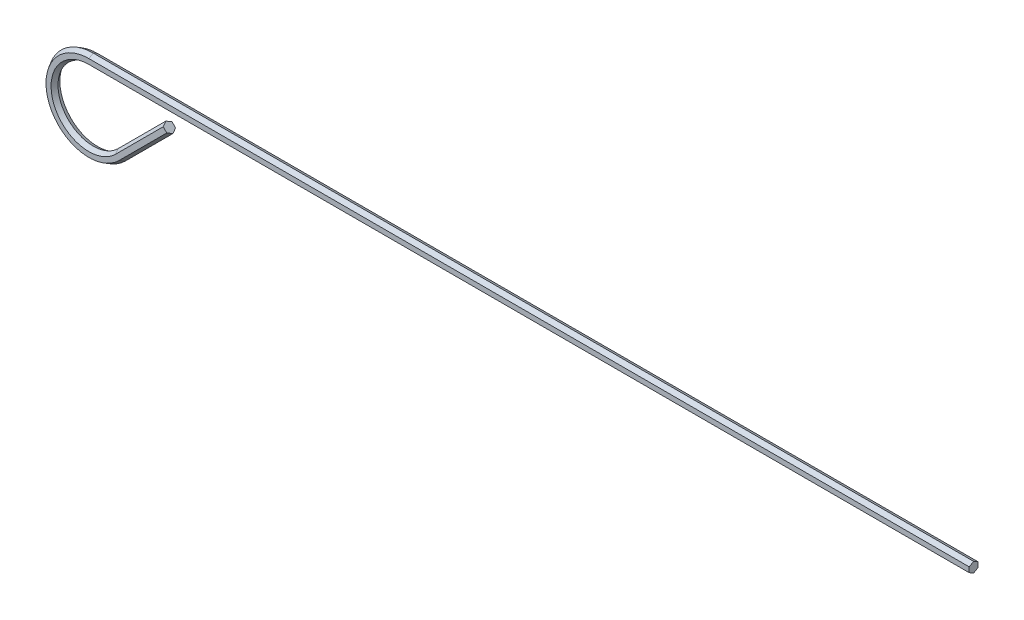
ISO-10303-21;
HEADER;
FILE_DESCRIPTION(('STEP AP214'),'2;1');
FILE_NAME('part.step','',(''),(''),'','','');
FILE_SCHEMA(('AUTOMOTIVE_DESIGN { 1 0 10303 214 1 1 1 1 }'));
ENDSEC;
DATA;
#1=APPLICATION_CONTEXT('core data for automotive mechanical design processes');
#2=APPLICATION_PROTOCOL_DEFINITION('international standard','automotive_design',2000,#1);
#3=PRODUCT_CONTEXT('',#1,'mechanical');
#4=PRODUCT('Part','Part','',(#3));
#5=PRODUCT_RELATED_PRODUCT_CATEGORY('part','',(#4));
#6=PRODUCT_DEFINITION_FORMATION('','',#4);
#7=PRODUCT_DEFINITION_CONTEXT('part definition',#1,'design');
#8=PRODUCT_DEFINITION('design','',#6,#7);
#9=PRODUCT_DEFINITION_SHAPE('','',#8);
#10=(LENGTH_UNIT() NAMED_UNIT(*) SI_UNIT(.MILLI.,.METRE.));
#11=(NAMED_UNIT(*) PLANE_ANGLE_UNIT() SI_UNIT($,.RADIAN.));
#12=(NAMED_UNIT(*) SI_UNIT($,.STERADIAN.) SOLID_ANGLE_UNIT());
#13=UNCERTAINTY_MEASURE_WITH_UNIT(LENGTH_MEASURE(1.E-05),#10,'distance_accuracy_value','');
#14=(GEOMETRIC_REPRESENTATION_CONTEXT(3) GLOBAL_UNCERTAINTY_ASSIGNED_CONTEXT((#13)) GLOBAL_UNIT_ASSIGNED_CONTEXT((#10,
#11,#12)) REPRESENTATION_CONTEXT('',''));
#15=CARTESIAN_POINT('',(0.,0.,0.));
#16=DIRECTION('',(0.,0.,1.));
#17=DIRECTION('',(1.,0.,0.));
#18=AXIS2_PLACEMENT_3D('',#15,#16,#17);
#19=CARTESIAN_POINT('',(3.44079956044201,-3.44079956044196,-0.5));
#20=DIRECTION('',(-0.612372435695791,0.612372435695797,0.5));
#21=DIRECTION('',(-0.707106781186551,-0.707106781186544,0.));
#22=AXIS2_PLACEMENT_3D('',#19,#20,#21);
#23=PLANE('',#22);
#24=DIRECTION('',(0.353553390593277,-0.353553390593271,0.866025403784438));
#25=VECTOR('',#24,1.);
#26=CARTESIAN_POINT('',(3.44079956044201,-3.44079956044196,-0.5));
#27=LINE('',#26,#25);
#28=CARTESIAN_POINT('',(3.44079956044201,-3.44079956044196,-0.5));
#29=VERTEX_POINT('',#28);
#30=CARTESIAN_POINT('',(3.64492370567395,-3.64492370567389,0.));
#31=VERTEX_POINT('',#30);
#32=EDGE_CURVE('E133',#29,#31,#27,.T.);
#33=ORIENTED_EDGE('',*,*,#32,.F.);
#34=DIRECTION('',(0.707106781186551,0.707106781186544,0.));
#35=VECTOR('',#34,1.);
#36=CARTESIAN_POINT('',(3.44079956044201,-3.44079956044196,-0.5));
#37=LINE('',#36,#35);
#38=CARTESIAN_POINT('',(8.85501312281519,1.97341400193116,-0.5));
#39=VERTEX_POINT('',#38);
#40=EDGE_CURVE('E42',#29,#39,#37,.T.);
#41=ORIENTED_EDGE('',*,*,#40,.T.);
#42=DIRECTION('',(0.353553390593277,-0.353553390593271,0.866025403784438));
#43=VECTOR('',#42,1.);
#44=CARTESIAN_POINT('',(8.85501312281519,1.97341400193116,-0.5));
#45=LINE('',#44,#43);
#46=CARTESIAN_POINT('',(9.05913726804712,1.76928985669923,0.));
#47=VERTEX_POINT('',#46);
#48=EDGE_CURVE('E49',#39,#47,#45,.T.);
#49=ORIENTED_EDGE('',*,*,#48,.T.);
#50=DIRECTION('',(0.707106781186551,0.707106781186544,0.));
#51=VECTOR('',#50,1.);
#52=CARTESIAN_POINT('',(3.64492370567395,-3.64492370567389,0.));
#53=LINE('',#52,#51);
#54=EDGE_CURVE('E11',#31,#47,#53,.T.);
#55=ORIENTED_EDGE('',*,*,#54,.F.);
#56=EDGE_LOOP('',(#33,#41,#49,#55));
#57=FACE_BOUND('',#56,.T.);
#58=ADVANCED_FACE('F34',(#57),#23,.F.);
#59=CARTESIAN_POINT('',(2.82842712474621,-2.82842712474617,0.));
#60=DIRECTION('',(0.612372435695791,-0.612372435695797,0.5));
#61=DIRECTION('',(0.707106781186551,0.707106781186544,0.));
#62=AXIS2_PLACEMENT_3D('',#59,#60,#61);
#63=PLANE('',#62);
#64=DIRECTION('',(0.353553390593277,-0.353553390593271,-0.866025403784438));
#65=VECTOR('',#64,1.);
#66=CARTESIAN_POINT('',(2.82842712474621,-2.82842712474617,0.));
#67=LINE('',#66,#65);
#68=CARTESIAN_POINT('',(2.82842712474621,-2.82842712474617,0.));
#69=VERTEX_POINT('',#68);
#70=CARTESIAN_POINT('',(3.03255126997815,-3.0325512699781,-0.5));
#71=VERTEX_POINT('',#70);
#72=EDGE_CURVE('E212',#69,#71,#67,.T.);
#73=ORIENTED_EDGE('',*,*,#72,.F.);
#74=DIRECTION('',(0.707106781186551,0.707106781186544,0.));
#75=VECTOR('',#74,1.);
#76=CARTESIAN_POINT('',(2.82842712474621,-2.82842712474617,0.));
#77=LINE('',#76,#75);
#78=CARTESIAN_POINT('',(8.24264068711939,2.58578643762695,0.));
#79=VERTEX_POINT('',#78);
#80=EDGE_CURVE('E256',#69,#79,#77,.T.);
#81=ORIENTED_EDGE('',*,*,#80,.T.);
#82=DIRECTION('',(0.353553390593277,-0.353553390593271,-0.866025403784438));
#83=VECTOR('',#82,1.);
#84=CARTESIAN_POINT('',(8.24264068711939,2.58578643762695,0.));
#85=LINE('',#84,#83);
#86=CARTESIAN_POINT('',(8.44676483235132,2.38166229239502,-0.5));
#87=VERTEX_POINT('',#86);
#88=EDGE_CURVE('E243',#79,#87,#85,.T.);
#89=ORIENTED_EDGE('',*,*,#88,.T.);
#90=DIRECTION('',(0.707106781186551,0.707106781186544,0.));
#91=VECTOR('',#90,1.);
#92=CARTESIAN_POINT('',(3.03255126997815,-3.0325512699781,-0.5));
#93=LINE('',#92,#91);
#94=EDGE_CURVE('E260',#71,#87,#93,.T.);
#95=ORIENTED_EDGE('',*,*,#94,.F.);
#96=EDGE_LOOP('',(#73,#81,#89,#95));
#97=FACE_BOUND('',#96,.T.);
#98=ADVANCED_FACE('F282',(#97),#63,.F.);
#99=CARTESIAN_POINT('',(2.82842712474621,-2.82842712474617,0.));
#100=DIRECTION('',(-0.612372435695791,0.612372435695797,0.5));
#101=DIRECTION('',(-0.707106781186551,-0.707106781186544,0.));
#102=AXIS2_PLACEMENT_3D('',#99,#100,#101);
#103=PLANE('',#102);
#104=DIRECTION('',(0.353553390593277,-0.353553390593271,0.866025403784438));
#105=VECTOR('',#104,1.);
#106=CARTESIAN_POINT('',(2.82842712474621,-2.82842712474617,0.));
#107=LINE('',#106,#105);
#108=CARTESIAN_POINT('',(3.03255126997815,-3.0325512699781,0.5));
#109=VERTEX_POINT('',#108);
#110=EDGE_CURVE('E209',#69,#109,#107,.T.);
#111=ORIENTED_EDGE('',*,*,#110,.T.);
#112=DIRECTION('',(0.707106781186551,0.707106781186544,0.));
#113=VECTOR('',#112,1.);
#114=CARTESIAN_POINT('',(3.03255126997815,-3.0325512699781,0.5));
#115=LINE('',#114,#113);
#116=CARTESIAN_POINT('',(8.44676483235132,2.38166229239502,0.5));
#117=VERTEX_POINT('',#116);
#118=EDGE_CURVE('E252',#109,#117,#115,.T.);
#119=ORIENTED_EDGE('',*,*,#118,.T.);
#120=DIRECTION('',(0.353553390593277,-0.353553390593271,0.866025403784438));
#121=VECTOR('',#120,1.);
#122=CARTESIAN_POINT('',(8.24264068711939,2.58578643762695,0.));
#123=LINE('',#122,#121);
#124=EDGE_CURVE('E240',#79,#117,#123,.T.);
#125=ORIENTED_EDGE('',*,*,#124,.F.);
#126=ORIENTED_EDGE('',*,*,#80,.F.);
#127=EDGE_LOOP('',(#111,#119,#125,#126));
#128=FACE_BOUND('',#127,.T.);
#129=ADVANCED_FACE('F286',(#128),#103,.T.);
#130=CARTESIAN_POINT('',(3.44079956044201,-3.44079956044196,0.5));
#131=DIRECTION('',(0.612372435695791,-0.612372435695797,0.5));
#132=DIRECTION('',(0.707106781186551,0.707106781186544,0.));
#133=AXIS2_PLACEMENT_3D('',#130,#131,#132);
#134=PLANE('',#133);
#135=DIRECTION('',(0.353553390593277,-0.353553390593271,-0.866025403784438));
#136=VECTOR('',#135,1.);
#137=CARTESIAN_POINT('',(3.44079956044201,-3.44079956044196,0.5));
#138=LINE('',#137,#136);
#139=CARTESIAN_POINT('',(3.44079956044201,-3.44079956044196,0.5));
#140=VERTEX_POINT('',#139);
#141=EDGE_CURVE('E160',#140,#31,#138,.T.);
#142=ORIENTED_EDGE('',*,*,#141,.T.);
#143=ORIENTED_EDGE('',*,*,#54,.T.);
#144=DIRECTION('',(0.353553390593277,-0.353553390593271,-0.866025403784438));
#145=VECTOR('',#144,1.);
#146=CARTESIAN_POINT('',(8.85501312281519,1.97341400193116,0.5));
#147=LINE('',#146,#145);
#148=CARTESIAN_POINT('',(8.85501312281519,1.97341400193116,0.5));
#149=VERTEX_POINT('',#148);
#150=EDGE_CURVE('E137',#149,#47,#147,.T.);
#151=ORIENTED_EDGE('',*,*,#150,.F.);
#152=DIRECTION('',(0.707106781186551,0.707106781186544,0.));
#153=VECTOR('',#152,1.);
#154=CARTESIAN_POINT('',(3.44079956044201,-3.44079956044196,0.5));
#155=LINE('',#154,#153);
#156=EDGE_CURVE('E249',#140,#149,#155,.T.);
#157=ORIENTED_EDGE('',*,*,#156,.F.);
#158=EDGE_LOOP('',(#142,#143,#151,#157));
#159=FACE_BOUND('',#158,.T.);
#160=ADVANCED_FACE('F291',(#159),#134,.T.);
#161=CARTESIAN_POINT('',(0.,0.,-0.5));
#162=DIRECTION('',(0.,0.,1.));
#163=DIRECTION('',(1.,0.,0.));
#164=AXIS2_PLACEMENT_3D('',#161,#162,#163);
#165=CONICAL_SURFACE('',#164,4.86602540378444,0.523598775598299);
#166=DIRECTION('',(0.,0.5,0.866025403784438));
#167=VECTOR('',#166,1.);
#168=CARTESIAN_POINT('',(0.,4.86602540378444,-0.5));
#169=LINE('',#168,#167);
#170=CARTESIAN_POINT('',(0.,4.86602540378444,-0.5));
#171=VERTEX_POINT('',#170);
#172=CARTESIAN_POINT('',(0.,5.15470053837925,0.));
#173=VERTEX_POINT('',#172);
#174=EDGE_CURVE('E130',#171,#173,#169,.T.);
#175=ORIENTED_EDGE('',*,*,#174,.F.);
#176=CARTESIAN_POINT('',(0.,0.,-0.5));
#177=DIRECTION('',(0.,0.,1.));
#178=DIRECTION('',(1.,0.,0.));
#179=AXIS2_PLACEMENT_3D('',#176,#177,#178);
#180=CIRCLE('',#179,4.86602540378444);
#181=EDGE_CURVE('E138',#171,#29,#180,.T.);
#182=ORIENTED_EDGE('',*,*,#181,.T.);
#183=ORIENTED_EDGE('',*,*,#32,.T.);
#184=CARTESIAN_POINT('',(0.,0.,0.));
#185=DIRECTION('',(0.,0.,1.));
#186=DIRECTION('',(1.,0.,0.));
#187=AXIS2_PLACEMENT_3D('',#184,#185,#186);
#188=CIRCLE('',#187,5.15470053837925);
#189=EDGE_CURVE('E125',#173,#31,#188,.T.);
#190=ORIENTED_EDGE('',*,*,#189,.F.);
#191=EDGE_LOOP('',(#175,#182,#183,#190));
#192=FACE_BOUND('',#191,.T.);
#193=ADVANCED_FACE('F127',(#192),#165,.T.);
#194=CARTESIAN_POINT('',(0.,0.,0.));
#195=DIRECTION('',(0.,0.,-1.));
#196=DIRECTION('',(-1.,0.,0.));
#197=AXIS2_PLACEMENT_3D('',#194,#195,#196);
#198=CONICAL_SURFACE('',#197,4.,0.523598775598299);
#199=DIRECTION('',(0.,0.5,-0.866025403784438));
#200=VECTOR('',#199,1.);
#201=CARTESIAN_POINT('',(0.,4.,0.));
#202=LINE('',#201,#200);
#203=CARTESIAN_POINT('',(0.,4.,0.));
#204=VERTEX_POINT('',#203);
#205=CARTESIAN_POINT('',(0.,4.28867513459481,-0.5));
#206=VERTEX_POINT('',#205);
#207=EDGE_CURVE('E165',#204,#206,#202,.T.);
#208=ORIENTED_EDGE('',*,*,#207,.F.);
#209=CARTESIAN_POINT('',(0.,0.,0.));
#210=DIRECTION('',(0.,0.,1.));
#211=DIRECTION('',(1.,0.,0.));
#212=AXIS2_PLACEMENT_3D('',#209,#210,#211);
#213=CIRCLE('',#212,4.);
#214=EDGE_CURVE('E224',#204,#69,#213,.T.);
#215=ORIENTED_EDGE('',*,*,#214,.T.);
#216=ORIENTED_EDGE('',*,*,#72,.T.);
#217=CARTESIAN_POINT('',(0.,0.,-0.5));
#218=DIRECTION('',(0.,0.,1.));
#219=DIRECTION('',(1.,0.,0.));
#220=AXIS2_PLACEMENT_3D('',#217,#218,#219);
#221=CIRCLE('',#220,4.28867513459481);
#222=EDGE_CURVE('E228',#206,#71,#221,.T.);
#223=ORIENTED_EDGE('',*,*,#222,.F.);
#224=EDGE_LOOP('',(#208,#215,#216,#223));
#225=FACE_BOUND('',#224,.T.);
#226=ADVANCED_FACE('F278',(#225),#198,.F.);
#227=CARTESIAN_POINT('',(0.,0.,0.));
#228=DIRECTION('',(0.,0.,1.));
#229=DIRECTION('',(1.,0.,0.));
#230=AXIS2_PLACEMENT_3D('',#227,#228,#229);
#231=CONICAL_SURFACE('',#230,4.,0.523598775598299);
#232=DIRECTION('',(0.,0.5,0.866025403784438));
#233=VECTOR('',#232,1.);
#234=CARTESIAN_POINT('',(0.,4.,0.));
#235=LINE('',#234,#233);
#236=CARTESIAN_POINT('',(0.,4.28867513459481,0.5));
#237=VERTEX_POINT('',#236);
#238=EDGE_CURVE('E172',#204,#237,#235,.T.);
#239=ORIENTED_EDGE('',*,*,#238,.T.);
#240=CARTESIAN_POINT('',(0.,0.,0.5));
#241=DIRECTION('',(0.,0.,1.));
#242=DIRECTION('',(1.,0.,0.));
#243=AXIS2_PLACEMENT_3D('',#240,#241,#242);
#244=CIRCLE('',#243,4.28867513459481);
#245=EDGE_CURVE('E220',#237,#109,#244,.T.);
#246=ORIENTED_EDGE('',*,*,#245,.T.);
#247=ORIENTED_EDGE('',*,*,#110,.F.);
#248=ORIENTED_EDGE('',*,*,#214,.F.);
#249=EDGE_LOOP('',(#239,#246,#247,#248));
#250=FACE_BOUND('',#249,.T.);
#251=ADVANCED_FACE('F284',(#250),#231,.F.);
#252=CARTESIAN_POINT('',(0.,0.,0.5));
#253=DIRECTION('',(0.,0.,-1.));
#254=DIRECTION('',(-1.,0.,0.));
#255=AXIS2_PLACEMENT_3D('',#252,#253,#254);
#256=CONICAL_SURFACE('',#255,4.86602540378444,0.523598775598299);
#257=DIRECTION('',(0.,0.5,-0.866025403784438));
#258=VECTOR('',#257,1.);
#259=CARTESIAN_POINT('',(0.,4.86602540378444,0.5));
#260=LINE('',#259,#258);
#261=CARTESIAN_POINT('',(0.,4.86602540378444,0.5));
#262=VERTEX_POINT('',#261);
#263=EDGE_CURVE('E141',#262,#173,#260,.T.);
#264=ORIENTED_EDGE('',*,*,#263,.T.);
#265=ORIENTED_EDGE('',*,*,#189,.T.);
#266=ORIENTED_EDGE('',*,*,#141,.F.);
#267=CARTESIAN_POINT('',(0.,0.,0.5));
#268=DIRECTION('',(0.,0.,1.));
#269=DIRECTION('',(1.,0.,0.));
#270=AXIS2_PLACEMENT_3D('',#267,#268,#269);
#271=CIRCLE('',#270,4.86602540378444);
#272=EDGE_CURVE('E145',#262,#140,#271,.T.);
#273=ORIENTED_EDGE('',*,*,#272,.F.);
#274=EDGE_LOOP('',(#264,#265,#266,#273));
#275=FACE_BOUND('',#274,.T.);
#276=ADVANCED_FACE('F143',(#275),#256,.T.);
#277=CARTESIAN_POINT('',(0.,4.86602540378444,0.5));
#278=DIRECTION('',(0.,-0.866025403784438,-0.5));
#279=DIRECTION('',(0.,0.5,-0.866025403784438));
#280=AXIS2_PLACEMENT_3D('',#277,#278,#279);
#281=PLANE('',#280);
#282=DIRECTION('',(0.,0.5,-0.866025403784438));
#283=VECTOR('',#282,1.);
#284=CARTESIAN_POINT('',(100.,4.86602540378443,0.5));
#285=LINE('',#284,#283);
#286=CARTESIAN_POINT('',(100.,4.86602540378443,0.5));
#287=VERTEX_POINT('',#286);
#288=CARTESIAN_POINT('',(100.,5.15470053837924,0.));
#289=VERTEX_POINT('',#288);
#290=EDGE_CURVE('E155',#287,#289,#285,.T.);
#291=ORIENTED_EDGE('',*,*,#290,.T.);
#292=DIRECTION('',(1.,0.,0.));
#293=VECTOR('',#292,1.);
#294=CARTESIAN_POINT('',(0.,5.15470053837925,0.));
#295=LINE('',#294,#293);
#296=EDGE_CURVE('E152',#173,#289,#295,.T.);
#297=ORIENTED_EDGE('',*,*,#296,.F.);
#298=ORIENTED_EDGE('',*,*,#263,.F.);
#299=DIRECTION('',(1.,0.,0.));
#300=VECTOR('',#299,1.);
#301=CARTESIAN_POINT('',(0.,4.86602540378444,0.5));
#302=LINE('',#301,#300);
#303=EDGE_CURVE('E178',#262,#287,#302,.T.);
#304=ORIENTED_EDGE('',*,*,#303,.T.);
#305=EDGE_LOOP('',(#291,#297,#298,#304));
#306=FACE_BOUND('',#305,.T.);
#307=ADVANCED_FACE('F153',(#306),#281,.F.);
#308=CARTESIAN_POINT('',(0.,4.86602540378444,-0.5));
#309=DIRECTION('',(0.,0.866025403784438,-0.5));
#310=DIRECTION('',(0.,0.5,0.866025403784438));
#311=AXIS2_PLACEMENT_3D('',#308,#309,#310);
#312=PLANE('',#311);
#313=DIRECTION('',(0.,0.5,0.866025403784438));
#314=VECTOR('',#313,1.);
#315=CARTESIAN_POINT('',(100.,4.86602540378443,-0.5));
#316=LINE('',#315,#314);
#317=CARTESIAN_POINT('',(100.,4.86602540378443,-0.5));
#318=VERTEX_POINT('',#317);
#319=EDGE_CURVE('E180',#318,#289,#316,.T.);
#320=ORIENTED_EDGE('',*,*,#319,.F.);
#321=DIRECTION('',(1.,0.,0.));
#322=VECTOR('',#321,1.);
#323=CARTESIAN_POINT('',(0.,4.86602540378444,-0.5));
#324=LINE('',#323,#322);
#325=EDGE_CURVE('E161',#171,#318,#324,.T.);
#326=ORIENTED_EDGE('',*,*,#325,.F.);
#327=ORIENTED_EDGE('',*,*,#174,.T.);
#328=ORIENTED_EDGE('',*,*,#296,.T.);
#329=EDGE_LOOP('',(#320,#326,#327,#328));
#330=FACE_BOUND('',#329,.T.);
#331=ADVANCED_FACE('F163',(#330),#312,.T.);
#332=CARTESIAN_POINT('',(0.,4.28867513459481,-0.5));
#333=DIRECTION('',(0.,0.,-1.));
#334=DIRECTION('',(-1.,0.,0.));
#335=AXIS2_PLACEMENT_3D('',#332,#333,#334);
#336=PLANE('',#335);
#337=DIRECTION('',(0.,1.,0.));
#338=VECTOR('',#337,1.);
#339=CARTESIAN_POINT('',(100.,4.2886751345948,-0.5));
#340=LINE('',#339,#338);
#341=CARTESIAN_POINT('',(100.,4.2886751345948,-0.5));
#342=VERTEX_POINT('',#341);
#343=EDGE_CURVE('E183',#342,#318,#340,.T.);
#344=ORIENTED_EDGE('',*,*,#343,.F.);
#345=DIRECTION('',(1.,0.,0.));
#346=VECTOR('',#345,1.);
#347=CARTESIAN_POINT('',(0.,4.28867513459481,-0.5));
#348=LINE('',#347,#346);
#349=EDGE_CURVE('E201',#206,#342,#348,.T.);
#350=ORIENTED_EDGE('',*,*,#349,.F.);
#351=ORIENTED_EDGE('',*,*,#222,.T.);
#352=ORIENTED_EDGE('',*,*,#94,.T.);
#353=DIRECTION('',(0.707106781186553,-0.707106781186542,0.));
#354=VECTOR('',#353,1.);
#355=CARTESIAN_POINT('',(8.44676483235132,2.38166229239502,-0.5));
#356=LINE('',#355,#354);
#357=EDGE_CURVE('E57',#87,#39,#356,.T.);
#358=ORIENTED_EDGE('',*,*,#357,.T.);
#359=ORIENTED_EDGE('',*,*,#40,.F.);
#360=ORIENTED_EDGE('',*,*,#181,.F.);
#361=ORIENTED_EDGE('',*,*,#325,.T.);
#362=EDGE_LOOP('',(#344,#350,#351,#352,#358,#359,#360,#361));
#363=FACE_BOUND('',#362,.T.);
#364=ADVANCED_FACE('F265',(#363),#336,.T.);
#365=CARTESIAN_POINT('',(0.,4.,0.));
#366=DIRECTION('',(0.,-0.866025403784438,-0.5));
#367=DIRECTION('',(0.,0.5,-0.866025403784438));
#368=AXIS2_PLACEMENT_3D('',#365,#366,#367);
#369=PLANE('',#368);
#370=DIRECTION('',(0.,0.5,-0.866025403784438));
#371=VECTOR('',#370,1.);
#372=CARTESIAN_POINT('',(100.,3.99999999999999,0.));
#373=LINE('',#372,#371);
#374=CARTESIAN_POINT('',(100.,3.99999999999999,0.));
#375=VERTEX_POINT('',#374);
#376=EDGE_CURVE('E186',#375,#342,#373,.T.);
#377=ORIENTED_EDGE('',*,*,#376,.F.);
#378=DIRECTION('',(1.,0.,0.));
#379=VECTOR('',#378,1.);
#380=CARTESIAN_POINT('',(0.,4.,0.));
#381=LINE('',#380,#379);
#382=EDGE_CURVE('E199',#204,#375,#381,.T.);
#383=ORIENTED_EDGE('',*,*,#382,.F.);
#384=ORIENTED_EDGE('',*,*,#207,.T.);
#385=ORIENTED_EDGE('',*,*,#349,.T.);
#386=EDGE_LOOP('',(#377,#383,#384,#385));
#387=FACE_BOUND('',#386,.T.);
#388=ADVANCED_FACE('F274',(#387),#369,.T.);
#389=CARTESIAN_POINT('',(0.,4.,0.));
#390=DIRECTION('',(0.,0.866025403784438,-0.5));
#391=DIRECTION('',(0.,0.5,0.866025403784438));
#392=AXIS2_PLACEMENT_3D('',#389,#390,#391);
#393=PLANE('',#392);
#394=DIRECTION('',(0.,0.5,0.866025403784438));
#395=VECTOR('',#394,1.);
#396=CARTESIAN_POINT('',(100.,3.99999999999999,0.));
#397=LINE('',#396,#395);
#398=CARTESIAN_POINT('',(100.,4.2886751345948,0.5));
#399=VERTEX_POINT('',#398);
#400=EDGE_CURVE('E189',#375,#399,#397,.T.);
#401=ORIENTED_EDGE('',*,*,#400,.T.);
#402=DIRECTION('',(1.,0.,0.));
#403=VECTOR('',#402,1.);
#404=CARTESIAN_POINT('',(0.,4.28867513459481,0.5));
#405=LINE('',#404,#403);
#406=EDGE_CURVE('E195',#237,#399,#405,.T.);
#407=ORIENTED_EDGE('',*,*,#406,.F.);
#408=ORIENTED_EDGE('',*,*,#238,.F.);
#409=ORIENTED_EDGE('',*,*,#382,.T.);
#410=EDGE_LOOP('',(#401,#407,#408,#409));
#411=FACE_BOUND('',#410,.T.);
#412=ADVANCED_FACE('F296',(#411),#393,.F.);
#413=CARTESIAN_POINT('',(0.,4.28867513459481,0.5));
#414=DIRECTION('',(0.,0.,-1.));
#415=DIRECTION('',(-1.,0.,0.));
#416=AXIS2_PLACEMENT_3D('',#413,#414,#415);
#417=PLANE('',#416);
#418=DIRECTION('',(0.,1.,0.));
#419=VECTOR('',#418,1.);
#420=CARTESIAN_POINT('',(100.,4.2886751345948,0.5));
#421=LINE('',#420,#419);
#422=EDGE_CURVE('E149',#399,#287,#421,.T.);
#423=ORIENTED_EDGE('',*,*,#422,.T.);
#424=ORIENTED_EDGE('',*,*,#303,.F.);
#425=ORIENTED_EDGE('',*,*,#272,.T.);
#426=ORIENTED_EDGE('',*,*,#156,.T.);
#427=DIRECTION('',(0.707106781186553,-0.707106781186542,0.));
#428=VECTOR('',#427,1.);
#429=CARTESIAN_POINT('',(8.44676483235132,2.38166229239502,0.5));
#430=LINE('',#429,#428);
#431=EDGE_CURVE('E236',#117,#149,#430,.T.);
#432=ORIENTED_EDGE('',*,*,#431,.F.);
#433=ORIENTED_EDGE('',*,*,#118,.F.);
#434=ORIENTED_EDGE('',*,*,#245,.F.);
#435=ORIENTED_EDGE('',*,*,#406,.T.);
#436=EDGE_LOOP('',(#423,#424,#425,#426,#432,#433,#434,#435));
#437=FACE_BOUND('',#436,.T.);
#438=ADVANCED_FACE('F293',(#437),#417,.F.);
#439=CARTESIAN_POINT('',(9.05913726804712,1.76928985669923,0.));
#440=DIRECTION('',(-0.707106781186542,-0.707106781186553,0.));
#441=DIRECTION('',(0.,0.,-1.));
#442=AXIS2_PLACEMENT_3D('',#439,#440,#441);
#443=PLANE('',#442);
#444=ORIENTED_EDGE('',*,*,#150,.T.);
#445=ORIENTED_EDGE('',*,*,#48,.F.);
#446=ORIENTED_EDGE('',*,*,#357,.F.);
#447=ORIENTED_EDGE('',*,*,#88,.F.);
#448=ORIENTED_EDGE('',*,*,#124,.T.);
#449=ORIENTED_EDGE('',*,*,#431,.T.);
#450=EDGE_LOOP('',(#444,#445,#446,#447,#448,#449));
#451=FACE_BOUND('',#450,.T.);
#452=ADVANCED_FACE('F289',(#451),#443,.F.);
#453=CARTESIAN_POINT('',(100.,5.15470053837924,0.));
#454=DIRECTION('',(1.,0.,0.));
#455=DIRECTION('',(0.,0.,-1.));
#456=AXIS2_PLACEMENT_3D('',#453,#454,#455);
#457=PLANE('',#456);
#458=ORIENTED_EDGE('',*,*,#290,.F.);
#459=ORIENTED_EDGE('',*,*,#422,.F.);
#460=ORIENTED_EDGE('',*,*,#400,.F.);
#461=ORIENTED_EDGE('',*,*,#376,.T.);
#462=ORIENTED_EDGE('',*,*,#343,.T.);
#463=ORIENTED_EDGE('',*,*,#319,.T.);
#464=EDGE_LOOP('',(#458,#459,#460,#461,#462,#463));
#465=FACE_BOUND('',#464,.T.);
#466=ADVANCED_FACE('F268',(#465),#457,.T.);
#467=CLOSED_SHELL('',(#58,#98,#129,#160,#193,#226,#251,#276,#307,#331,#364,#388,#412,#438,#452,#466));
#468=MANIFOLD_SOLID_BREP('B2',#467);
#469=ADVANCED_BREP_SHAPE_REPRESENTATION('',(#18,#468),#14);
#470=SHAPE_DEFINITION_REPRESENTATION(#9,#469);
ENDSEC;
END-ISO-10303-21;
